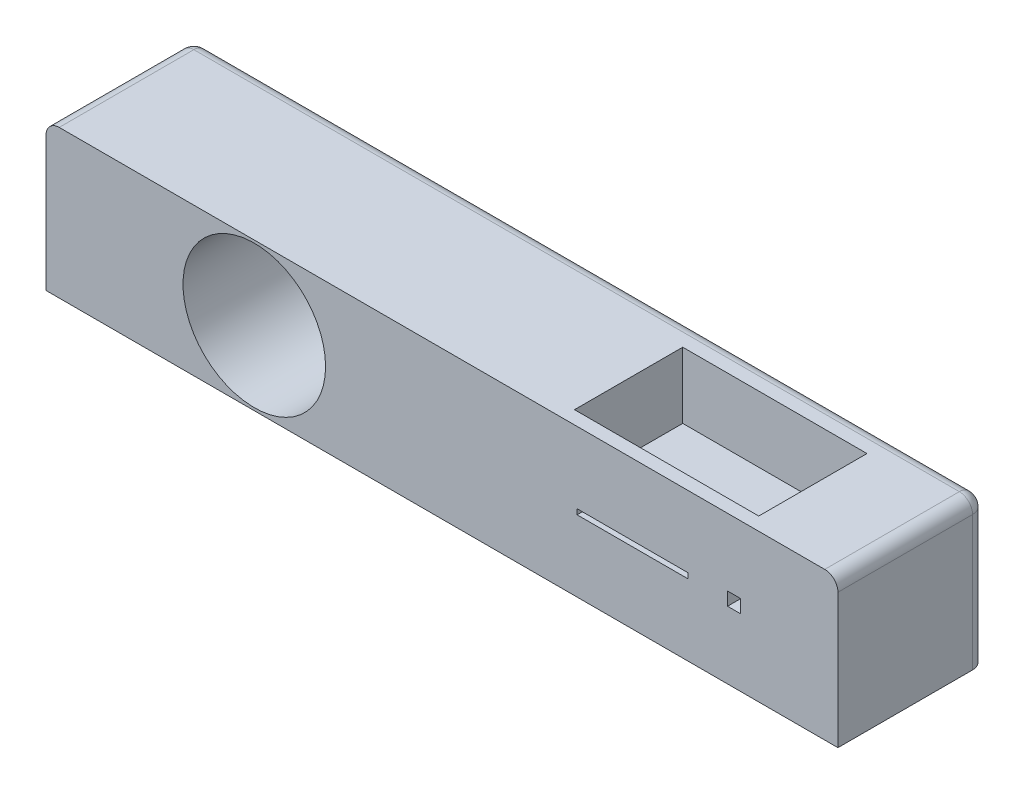
ISO-10303-21;
HEADER;
FILE_DESCRIPTION(('STEP AP214'),'2;1');
FILE_NAME('part.step','',(''),(''),'','','');
FILE_SCHEMA(('AUTOMOTIVE_DESIGN { 1 0 10303 214 1 1 1 1 }'));
ENDSEC;
DATA;
#1=APPLICATION_CONTEXT('core data for automotive mechanical design processes');
#2=APPLICATION_PROTOCOL_DEFINITION('international standard','automotive_design',2000,#1);
#3=PRODUCT_CONTEXT('',#1,'mechanical');
#4=PRODUCT('Part','Part','',(#3));
#5=PRODUCT_RELATED_PRODUCT_CATEGORY('part','',(#4));
#6=PRODUCT_DEFINITION_FORMATION('','',#4);
#7=PRODUCT_DEFINITION_CONTEXT('part definition',#1,'design');
#8=PRODUCT_DEFINITION('design','',#6,#7);
#9=PRODUCT_DEFINITION_SHAPE('','',#8);
#10=(LENGTH_UNIT() NAMED_UNIT(*) SI_UNIT(.MILLI.,.METRE.));
#11=(NAMED_UNIT(*) PLANE_ANGLE_UNIT() SI_UNIT($,.RADIAN.));
#12=(NAMED_UNIT(*) SI_UNIT($,.STERADIAN.) SOLID_ANGLE_UNIT());
#13=UNCERTAINTY_MEASURE_WITH_UNIT(LENGTH_MEASURE(1.E-05),#10,'distance_accuracy_value','');
#14=(GEOMETRIC_REPRESENTATION_CONTEXT(3) GLOBAL_UNCERTAINTY_ASSIGNED_CONTEXT((#13)) GLOBAL_UNIT_ASSIGNED_CONTEXT((#10,
#11,#12)) REPRESENTATION_CONTEXT('',''));
#15=CARTESIAN_POINT('',(0.,0.,0.));
#16=DIRECTION('',(0.,0.,1.));
#17=DIRECTION('',(1.,0.,0.));
#18=AXIS2_PLACEMENT_3D('',#15,#16,#17);
#19=CARTESIAN_POINT('',(150.,-28.,56.));
#20=DIRECTION('',(-1.,0.,0.));
#21=DIRECTION('',(0.,0.,1.));
#22=AXIS2_PLACEMENT_3D('',#19,#20,#21);
#23=PLANE('',#22);
#24=DIRECTION('',(0.,0.,-1.));
#25=VECTOR('',#24,1.);
#26=CARTESIAN_POINT('',(150.,-28.,56.));
#27=LINE('',#26,#25);
#28=CARTESIAN_POINT('',(150.,-28.,56.));
#29=VERTEX_POINT('',#28);
#30=CARTESIAN_POINT('',(150.,-28.,5.));
#31=VERTEX_POINT('',#30);
#32=EDGE_CURVE('E289',#29,#31,#27,.T.);
#33=ORIENTED_EDGE('',*,*,#32,.T.);
#34=DIRECTION('',(0.,1.,0.));
#35=VECTOR('',#34,1.);
#36=CARTESIAN_POINT('',(150.,28.,5.));
#37=LINE('',#36,#35);
#38=CARTESIAN_POINT('',(150.,23.,5.));
#39=VERTEX_POINT('',#38);
#40=EDGE_CURVE('E12',#31,#39,#37,.T.);
#41=ORIENTED_EDGE('',*,*,#40,.T.);
#42=DIRECTION('',(0.,0.,-1.));
#43=VECTOR('',#42,1.);
#44=CARTESIAN_POINT('',(150.,23.,56.));
#45=LINE('',#44,#43);
#46=CARTESIAN_POINT('',(150.,23.,56.));
#47=VERTEX_POINT('',#46);
#48=EDGE_CURVE('E44',#39,#47,#45,.F.);
#49=ORIENTED_EDGE('',*,*,#48,.T.);
#50=DIRECTION('',(0.,1.,0.));
#51=VECTOR('',#50,1.);
#52=CARTESIAN_POINT('',(150.,-28.,56.));
#53=LINE('',#52,#51);
#54=EDGE_CURVE('E278',#29,#47,#53,.T.);
#55=ORIENTED_EDGE('',*,*,#54,.F.);
#56=EDGE_LOOP('',(#33,#41,#49,#55));
#57=FACE_BOUND('',#56,.T.);
#58=ADVANCED_FACE('F35',(#57),#23,.F.);
#59=CARTESIAN_POINT('',(-150.,28.,56.));
#60=DIRECTION('',(0.,-1.,0.));
#61=DIRECTION('',(0.,0.,-1.));
#62=AXIS2_PLACEMENT_3D('',#59,#60,#61);
#63=PLANE('',#62);
#64=DIRECTION('',(-1.,0.,0.));
#65=VECTOR('',#64,1.);
#66=CARTESIAN_POINT('',(115.,28.,10.));
#67=LINE('',#66,#65);
#68=CARTESIAN_POINT('',(115.,28.,10.));
#69=VERTEX_POINT('',#68);
#70=CARTESIAN_POINT('',(45.2095928076517,28.,10.));
#71=VERTEX_POINT('',#70);
#72=EDGE_CURVE('E190',#69,#71,#67,.T.);
#73=ORIENTED_EDGE('',*,*,#72,.F.);
#74=DIRECTION('',(0.,0.,-1.));
#75=VECTOR('',#74,1.);
#76=CARTESIAN_POINT('',(115.,28.,51.));
#77=LINE('',#76,#75);
#78=CARTESIAN_POINT('',(115.,28.,51.));
#79=VERTEX_POINT('',#78);
#80=EDGE_CURVE('E52',#79,#69,#77,.T.);
#81=ORIENTED_EDGE('',*,*,#80,.F.);
#82=DIRECTION('',(1.,0.,0.));
#83=VECTOR('',#82,1.);
#84=CARTESIAN_POINT('',(115.,28.,51.));
#85=LINE('',#84,#83);
#86=CARTESIAN_POINT('',(45.2095928076517,28.,51.));
#87=VERTEX_POINT('',#86);
#88=EDGE_CURVE('E197',#87,#79,#85,.T.);
#89=ORIENTED_EDGE('',*,*,#88,.F.);
#90=DIRECTION('',(0.,0.,1.));
#91=VECTOR('',#90,1.);
#92=CARTESIAN_POINT('',(45.2095928076517,28.,51.));
#93=LINE('',#92,#91);
#94=EDGE_CURVE('E180',#71,#87,#93,.T.);
#95=ORIENTED_EDGE('',*,*,#94,.F.);
#96=EDGE_LOOP('',(#73,#81,#89,#95));
#97=FACE_BOUND('',#96,.T.);
#98=DIRECTION('',(-1.,0.,0.));
#99=VECTOR('',#98,1.);
#100=CARTESIAN_POINT('',(-150.,28.,5.));
#101=LINE('',#100,#99);
#102=CARTESIAN_POINT('',(145.,28.,5.));
#103=VERTEX_POINT('',#102);
#104=CARTESIAN_POINT('',(-145.,28.,5.));
#105=VERTEX_POINT('',#104);
#106=EDGE_CURVE('E312',#103,#105,#101,.T.);
#107=ORIENTED_EDGE('',*,*,#106,.T.);
#108=DIRECTION('',(0.,0.,-1.));
#109=VECTOR('',#108,1.);
#110=CARTESIAN_POINT('',(-145.,28.,56.));
#111=LINE('',#110,#109);
#112=CARTESIAN_POINT('',(-145.,28.,56.));
#113=VERTEX_POINT('',#112);
#114=EDGE_CURVE('E316',#105,#113,#111,.F.);
#115=ORIENTED_EDGE('',*,*,#114,.T.);
#116=DIRECTION('',(-1.,0.,0.));
#117=VECTOR('',#116,1.);
#118=CARTESIAN_POINT('',(-150.,28.,56.));
#119=LINE('',#118,#117);
#120=CARTESIAN_POINT('',(145.,28.,56.));
#121=VERTEX_POINT('',#120);
#122=EDGE_CURVE('E281',#121,#113,#119,.T.);
#123=ORIENTED_EDGE('',*,*,#122,.F.);
#124=DIRECTION('',(0.,0.,-1.));
#125=VECTOR('',#124,1.);
#126=CARTESIAN_POINT('',(145.,28.,56.));
#127=LINE('',#126,#125);
#128=EDGE_CURVE('E314',#121,#103,#127,.T.);
#129=ORIENTED_EDGE('',*,*,#128,.T.);
#130=EDGE_LOOP('',(#107,#115,#123,#129));
#131=FACE_BOUND('',#130,.T.);
#132=ADVANCED_FACE('F194',(#97,#131),#63,.F.);
#133=CARTESIAN_POINT('',(-150.,-28.,56.));
#134=DIRECTION('',(1.,0.,0.));
#135=DIRECTION('',(0.,0.,-1.));
#136=AXIS2_PLACEMENT_3D('',#133,#134,#135);
#137=PLANE('',#136);
#138=DIRECTION('',(0.,0.,-1.));
#139=VECTOR('',#138,1.);
#140=CARTESIAN_POINT('',(-150.,23.,56.));
#141=LINE('',#140,#139);
#142=CARTESIAN_POINT('',(-150.,23.,56.));
#143=VERTEX_POINT('',#142);
#144=CARTESIAN_POINT('',(-150.,23.,5.));
#145=VERTEX_POINT('',#144);
#146=EDGE_CURVE('E297',#143,#145,#141,.T.);
#147=ORIENTED_EDGE('',*,*,#146,.T.);
#148=DIRECTION('',(0.,-1.,0.));
#149=VECTOR('',#148,1.);
#150=CARTESIAN_POINT('',(-150.,-28.,5.));
#151=LINE('',#150,#149);
#152=CARTESIAN_POINT('',(-150.,-28.,5.));
#153=VERTEX_POINT('',#152);
#154=EDGE_CURVE('E299',#145,#153,#151,.T.);
#155=ORIENTED_EDGE('',*,*,#154,.T.);
#156=DIRECTION('',(0.,0.,-1.));
#157=VECTOR('',#156,1.);
#158=CARTESIAN_POINT('',(-150.,-28.,56.));
#159=LINE('',#158,#157);
#160=CARTESIAN_POINT('',(-150.,-28.,56.));
#161=VERTEX_POINT('',#160);
#162=EDGE_CURVE('E294',#161,#153,#159,.T.);
#163=ORIENTED_EDGE('',*,*,#162,.F.);
#164=DIRECTION('',(0.,-1.,0.));
#165=VECTOR('',#164,1.);
#166=CARTESIAN_POINT('',(-150.,-28.,56.));
#167=LINE('',#166,#165);
#168=EDGE_CURVE('E285',#143,#161,#167,.T.);
#169=ORIENTED_EDGE('',*,*,#168,.F.);
#170=EDGE_LOOP('',(#147,#155,#163,#169));
#171=FACE_BOUND('',#170,.T.);
#172=ADVANCED_FACE('F363',(#171),#137,.F.);
#173=CARTESIAN_POINT('',(-150.,-28.,56.));
#174=DIRECTION('',(0.,1.,0.));
#175=DIRECTION('',(0.,0.,1.));
#176=AXIS2_PLACEMENT_3D('',#173,#174,#175);
#177=PLANE('',#176);
#178=ORIENTED_EDGE('',*,*,#162,.T.);
#179=CARTESIAN_POINT('',(-145.,-28.,5.));
#180=DIRECTION('',(0.,1.,0.));
#181=DIRECTION('',(0.,0.,1.));
#182=AXIS2_PLACEMENT_3D('',#179,#180,#181);
#183=CIRCLE('',#182,5.);
#184=CARTESIAN_POINT('',(-145.,-28.,0.));
#185=VERTEX_POINT('',#184);
#186=EDGE_CURVE('E304',#153,#185,#183,.F.);
#187=ORIENTED_EDGE('',*,*,#186,.T.);
#188=DIRECTION('',(1.,0.,0.));
#189=VECTOR('',#188,1.);
#190=CARTESIAN_POINT('',(-150.,-28.,0.));
#191=LINE('',#190,#189);
#192=CARTESIAN_POINT('',(145.,-28.,0.));
#193=VERTEX_POINT('',#192);
#194=EDGE_CURVE('E282',#185,#193,#191,.T.);
#195=ORIENTED_EDGE('',*,*,#194,.T.);
#196=CARTESIAN_POINT('',(145.,-28.,5.));
#197=DIRECTION('',(0.,1.,0.));
#198=DIRECTION('',(0.,0.,1.));
#199=AXIS2_PLACEMENT_3D('',#196,#197,#198);
#200=CIRCLE('',#199,5.);
#201=EDGE_CURVE('E302',#193,#31,#200,.F.);
#202=ORIENTED_EDGE('',*,*,#201,.T.);
#203=ORIENTED_EDGE('',*,*,#32,.F.);
#204=DIRECTION('',(1.,0.,0.));
#205=VECTOR('',#204,1.);
#206=CARTESIAN_POINT('',(-150.,-28.,56.));
#207=LINE('',#206,#205);
#208=EDGE_CURVE('E287',#161,#29,#207,.T.);
#209=ORIENTED_EDGE('',*,*,#208,.F.);
#210=EDGE_LOOP('',(#178,#187,#195,#202,#203,#209));
#211=FACE_BOUND('',#210,.T.);
#212=ADVANCED_FACE('F368',(#211),#177,.F.);
#213=CARTESIAN_POINT('',(0.,0.,56.));
#214=DIRECTION('',(0.,0.,-1.));
#215=DIRECTION('',(-1.,0.,0.));
#216=AXIS2_PLACEMENT_3D('',#213,#214,#215);
#217=PLANE('',#216);
#218=CARTESIAN_POINT('',(-71.0953562443222,0.,56.));
#219=DIRECTION('',(0.,0.,1.));
#220=DIRECTION('',(1.,0.,0.));
#221=AXIS2_PLACEMENT_3D('',#218,#219,#220);
#222=CIRCLE('',#221,27.);
#223=CARTESIAN_POINT('',(-44.0953562443222,0.,56.));
#224=VERTEX_POINT('',#223);
#225=EDGE_CURVE('E210',#224,#224,#222,.T.);
#226=ORIENTED_EDGE('',*,*,#225,.F.);
#227=EDGE_LOOP('',(#226));
#228=FACE_BOUND('',#227,.T.);
#229=DIRECTION('',(0.,-1.,0.));
#230=VECTOR('',#229,1.);
#231=CARTESIAN_POINT('',(51.1822612430776,0.999999999999991,56.));
#232=LINE('',#231,#230);
#233=CARTESIAN_POINT('',(51.1822612430776,0.999999999999991,56.));
#234=VERTEX_POINT('',#233);
#235=CARTESIAN_POINT('',(51.1822612430776,-1.00000000000001,56.));
#236=VERTEX_POINT('',#235);
#237=EDGE_CURVE('E220',#234,#236,#232,.T.);
#238=ORIENTED_EDGE('',*,*,#237,.F.);
#239=DIRECTION('',(-1.,0.,0.));
#240=VECTOR('',#239,1.);
#241=CARTESIAN_POINT('',(51.1822612430776,0.999999999999991,56.));
#242=LINE('',#241,#240);
#243=CARTESIAN_POINT('',(93.1822612430776,0.999999999999991,56.));
#244=VERTEX_POINT('',#243);
#245=EDGE_CURVE('E223',#244,#234,#242,.T.);
#246=ORIENTED_EDGE('',*,*,#245,.F.);
#247=DIRECTION('',(0.,1.,0.));
#248=VECTOR('',#247,1.);
#249=CARTESIAN_POINT('',(93.1822612430776,0.999999999999991,56.));
#250=LINE('',#249,#248);
#251=CARTESIAN_POINT('',(93.1822612430776,-1.00000000000001,56.));
#252=VERTEX_POINT('',#251);
#253=EDGE_CURVE('E226',#252,#244,#250,.T.);
#254=ORIENTED_EDGE('',*,*,#253,.F.);
#255=DIRECTION('',(1.,0.,0.));
#256=VECTOR('',#255,1.);
#257=CARTESIAN_POINT('',(51.1822612430776,-1.00000000000001,56.));
#258=LINE('',#257,#256);
#259=EDGE_CURVE('E60',#236,#252,#258,.T.);
#260=ORIENTED_EDGE('',*,*,#259,.F.);
#261=EDGE_LOOP('',(#238,#246,#254,#260));
#262=FACE_BOUND('',#261,.T.);
#263=DIRECTION('',(0.,-1.,0.));
#264=VECTOR('',#263,1.);
#265=CARTESIAN_POINT('',(108.182261243078,2.5,56.));
#266=LINE('',#265,#264);
#267=CARTESIAN_POINT('',(108.182261243078,2.5,56.));
#268=VERTEX_POINT('',#267);
#269=CARTESIAN_POINT('',(108.182261243078,-2.5,56.));
#270=VERTEX_POINT('',#269);
#271=EDGE_CURVE('E251',#268,#270,#266,.T.);
#272=ORIENTED_EDGE('',*,*,#271,.F.);
#273=DIRECTION('',(-1.,0.,0.));
#274=VECTOR('',#273,1.);
#275=CARTESIAN_POINT('',(108.182261243078,2.5,56.));
#276=LINE('',#275,#274);
#277=CARTESIAN_POINT('',(113.182261243078,2.5,56.));
#278=VERTEX_POINT('',#277);
#279=EDGE_CURVE('E254',#278,#268,#276,.T.);
#280=ORIENTED_EDGE('',*,*,#279,.F.);
#281=DIRECTION('',(0.,1.,0.));
#282=VECTOR('',#281,1.);
#283=CARTESIAN_POINT('',(113.182261243078,2.5,56.));
#284=LINE('',#283,#282);
#285=CARTESIAN_POINT('',(113.182261243078,-2.5,56.));
#286=VERTEX_POINT('',#285);
#287=EDGE_CURVE('E208',#286,#278,#284,.T.);
#288=ORIENTED_EDGE('',*,*,#287,.F.);
#289=DIRECTION('',(1.,0.,0.));
#290=VECTOR('',#289,1.);
#291=CARTESIAN_POINT('',(108.182261243078,-2.5,56.));
#292=LINE('',#291,#290);
#293=EDGE_CURVE('E248',#270,#286,#292,.T.);
#294=ORIENTED_EDGE('',*,*,#293,.F.);
#295=EDGE_LOOP('',(#272,#280,#288,#294));
#296=FACE_BOUND('',#295,.T.);
#297=ORIENTED_EDGE('',*,*,#122,.T.);
#298=CARTESIAN_POINT('',(-145.,23.,56.));
#299=DIRECTION('',(0.,0.,-1.));
#300=DIRECTION('',(-1.,0.,0.));
#301=AXIS2_PLACEMENT_3D('',#298,#299,#300);
#302=CIRCLE('',#301,5.);
#303=EDGE_CURVE('E320',#113,#143,#302,.F.);
#304=ORIENTED_EDGE('',*,*,#303,.T.);
#305=ORIENTED_EDGE('',*,*,#168,.T.);
#306=ORIENTED_EDGE('',*,*,#208,.T.);
#307=ORIENTED_EDGE('',*,*,#54,.T.);
#308=CARTESIAN_POINT('',(145.,23.,56.));
#309=DIRECTION('',(0.,0.,-1.));
#310=DIRECTION('',(-1.,0.,0.));
#311=AXIS2_PLACEMENT_3D('',#308,#309,#310);
#312=CIRCLE('',#311,5.);
#313=EDGE_CURVE('E318',#47,#121,#312,.F.);
#314=ORIENTED_EDGE('',*,*,#313,.T.);
#315=EDGE_LOOP('',(#297,#304,#305,#306,#307,#314));
#316=FACE_BOUND('',#315,.T.);
#317=ADVANCED_FACE('F360',(#228,#262,#296,#316),#217,.F.);
#318=CARTESIAN_POINT('',(0.,0.,0.));
#319=DIRECTION('',(0.,0.,-1.));
#320=DIRECTION('',(-1.,0.,0.));
#321=AXIS2_PLACEMENT_3D('',#318,#319,#320);
#322=PLANE('',#321);
#323=ORIENTED_EDGE('',*,*,#194,.F.);
#324=DIRECTION('',(0.,-1.,0.));
#325=VECTOR('',#324,1.);
#326=CARTESIAN_POINT('',(-145.,28.,0.));
#327=LINE('',#326,#325);
#328=CARTESIAN_POINT('',(-145.,23.,0.));
#329=VERTEX_POINT('',#328);
#330=EDGE_CURVE('E310',#185,#329,#327,.F.);
#331=ORIENTED_EDGE('',*,*,#330,.T.);
#332=DIRECTION('',(-1.,0.,0.));
#333=VECTOR('',#332,1.);
#334=CARTESIAN_POINT('',(150.,23.,0.));
#335=LINE('',#334,#333);
#336=CARTESIAN_POINT('',(145.,23.,0.));
#337=VERTEX_POINT('',#336);
#338=EDGE_CURVE('E306',#329,#337,#335,.F.);
#339=ORIENTED_EDGE('',*,*,#338,.T.);
#340=DIRECTION('',(0.,1.,0.));
#341=VECTOR('',#340,1.);
#342=CARTESIAN_POINT('',(145.,-28.,0.));
#343=LINE('',#342,#341);
#344=EDGE_CURVE('E308',#337,#193,#343,.F.);
#345=ORIENTED_EDGE('',*,*,#344,.T.);
#346=EDGE_LOOP('',(#323,#331,#339,#345));
#347=FACE_BOUND('',#346,.T.);
#348=ADVANCED_FACE('F379',(#347),#322,.T.);
#349=CARTESIAN_POINT('',(145.,-28.,5.));
#350=DIRECTION('',(0.,-1.,0.));
#351=DIRECTION('',(0.,0.,-1.));
#352=AXIS2_PLACEMENT_3D('',#349,#350,#351);
#353=CYLINDRICAL_SURFACE('',#352,5.);
#354=ORIENTED_EDGE('',*,*,#201,.F.);
#355=ORIENTED_EDGE('',*,*,#344,.F.);
#356=CARTESIAN_POINT('',(145.,23.,5.));
#357=DIRECTION('',(0.,1.,0.));
#358=DIRECTION('',(0.,0.,1.));
#359=AXIS2_PLACEMENT_3D('',#356,#357,#358);
#360=CIRCLE('',#359,5.);
#361=EDGE_CURVE('E39',#39,#337,#360,.T.);
#362=ORIENTED_EDGE('',*,*,#361,.F.);
#363=ORIENTED_EDGE('',*,*,#40,.F.);
#364=EDGE_LOOP('',(#354,#355,#362,#363));
#365=FACE_BOUND('',#364,.T.);
#366=ADVANCED_FACE('F37',(#365),#353,.T.);
#367=CARTESIAN_POINT('',(145.,23.,56.));
#368=DIRECTION('',(0.,0.,-1.));
#369=DIRECTION('',(-1.,0.,0.));
#370=AXIS2_PLACEMENT_3D('',#367,#368,#369);
#371=CYLINDRICAL_SURFACE('',#370,5.);
#372=ORIENTED_EDGE('',*,*,#313,.F.);
#373=ORIENTED_EDGE('',*,*,#48,.F.);
#374=CARTESIAN_POINT('',(145.,23.,5.));
#375=DIRECTION('',(0.,0.,-1.));
#376=DIRECTION('',(-1.,0.,0.));
#377=AXIS2_PLACEMENT_3D('',#374,#375,#376);
#378=CIRCLE('',#377,5.);
#379=EDGE_CURVE('E333',#103,#39,#378,.T.);
#380=ORIENTED_EDGE('',*,*,#379,.F.);
#381=ORIENTED_EDGE('',*,*,#128,.F.);
#382=EDGE_LOOP('',(#372,#373,#380,#381));
#383=FACE_BOUND('',#382,.T.);
#384=ADVANCED_FACE('F374',(#383),#371,.T.);
#385=CARTESIAN_POINT('',(145.,23.,5.));
#386=DIRECTION('',(0.,0.,1.));
#387=DIRECTION('',(1.,0.,0.));
#388=AXIS2_PLACEMENT_3D('',#385,#386,#387);
#389=SPHERICAL_SURFACE('',#388,5.);
#390=ORIENTED_EDGE('',*,*,#379,.T.);
#391=ORIENTED_EDGE('',*,*,#361,.T.);
#392=CARTESIAN_POINT('',(145.,23.,5.));
#393=DIRECTION('',(1.,0.,0.));
#394=DIRECTION('',(0.,0.,-1.));
#395=AXIS2_PLACEMENT_3D('',#392,#393,#394);
#396=CIRCLE('',#395,5.);
#397=EDGE_CURVE('E331',#103,#337,#396,.F.);
#398=ORIENTED_EDGE('',*,*,#397,.F.);
#399=EDGE_LOOP('',(#390,#391,#398));
#400=FACE_BOUND('',#399,.T.);
#401=ADVANCED_FACE('F340',(#400),#389,.T.);
#402=CARTESIAN_POINT('',(-150.,23.,5.));
#403=DIRECTION('',(1.,0.,0.));
#404=DIRECTION('',(0.,0.,-1.));
#405=AXIS2_PLACEMENT_3D('',#402,#403,#404);
#406=CYLINDRICAL_SURFACE('',#405,5.);
#407=ORIENTED_EDGE('',*,*,#397,.T.);
#408=ORIENTED_EDGE('',*,*,#338,.F.);
#409=CARTESIAN_POINT('',(-145.,23.,5.));
#410=DIRECTION('',(-1.,0.,0.));
#411=DIRECTION('',(0.,0.,1.));
#412=AXIS2_PLACEMENT_3D('',#409,#410,#411);
#413=CIRCLE('',#412,5.);
#414=EDGE_CURVE('E328',#105,#329,#413,.T.);
#415=ORIENTED_EDGE('',*,*,#414,.F.);
#416=ORIENTED_EDGE('',*,*,#106,.F.);
#417=EDGE_LOOP('',(#407,#408,#415,#416));
#418=FACE_BOUND('',#417,.T.);
#419=ADVANCED_FACE('F347',(#418),#406,.T.);
#420=CARTESIAN_POINT('',(-145.,23.,56.));
#421=DIRECTION('',(0.,0.,-1.));
#422=DIRECTION('',(-1.,0.,0.));
#423=AXIS2_PLACEMENT_3D('',#420,#421,#422);
#424=CYLINDRICAL_SURFACE('',#423,5.);
#425=ORIENTED_EDGE('',*,*,#303,.F.);
#426=ORIENTED_EDGE('',*,*,#114,.F.);
#427=CARTESIAN_POINT('',(-145.,23.,5.));
#428=DIRECTION('',(0.,0.,-1.));
#429=DIRECTION('',(-1.,0.,0.));
#430=AXIS2_PLACEMENT_3D('',#427,#428,#429);
#431=CIRCLE('',#430,5.);
#432=EDGE_CURVE('E325',#145,#105,#431,.T.);
#433=ORIENTED_EDGE('',*,*,#432,.F.);
#434=ORIENTED_EDGE('',*,*,#146,.F.);
#435=EDGE_LOOP('',(#425,#426,#433,#434));
#436=FACE_BOUND('',#435,.T.);
#437=ADVANCED_FACE('F355',(#436),#424,.T.);
#438=CARTESIAN_POINT('',(-145.,23.,5.));
#439=DIRECTION('',(0.,0.,1.));
#440=DIRECTION('',(1.,0.,0.));
#441=AXIS2_PLACEMENT_3D('',#438,#439,#440);
#442=SPHERICAL_SURFACE('',#441,5.);
#443=ORIENTED_EDGE('',*,*,#432,.T.);
#444=ORIENTED_EDGE('',*,*,#414,.T.);
#445=CARTESIAN_POINT('',(-145.,23.,5.));
#446=DIRECTION('',(0.,1.,0.));
#447=DIRECTION('',(-1.,0.,0.));
#448=AXIS2_PLACEMENT_3D('',#445,#446,#447);
#449=CIRCLE('',#448,5.);
#450=EDGE_CURVE('E217',#145,#329,#449,.F.);
#451=ORIENTED_EDGE('',*,*,#450,.F.);
#452=EDGE_LOOP('',(#443,#444,#451));
#453=FACE_BOUND('',#452,.T.);
#454=ADVANCED_FACE('F383',(#453),#442,.T.);
#455=CARTESIAN_POINT('',(-145.,-28.,5.));
#456=DIRECTION('',(0.,1.,0.));
#457=DIRECTION('',(0.,0.,1.));
#458=AXIS2_PLACEMENT_3D('',#455,#456,#457);
#459=CYLINDRICAL_SURFACE('',#458,5.);
#460=ORIENTED_EDGE('',*,*,#450,.T.);
#461=ORIENTED_EDGE('',*,*,#330,.F.);
#462=ORIENTED_EDGE('',*,*,#186,.F.);
#463=ORIENTED_EDGE('',*,*,#154,.F.);
#464=EDGE_LOOP('',(#460,#461,#462,#463));
#465=FACE_BOUND('',#464,.T.);
#466=ADVANCED_FACE('F381',(#465),#459,.T.);
#467=CARTESIAN_POINT('',(0.,0.,5.99999999999999));
#468=DIRECTION('',(0.,0.,-1.));
#469=DIRECTION('',(-1.,0.,0.));
#470=AXIS2_PLACEMENT_3D('',#467,#468,#469);
#471=PLANE('',#470);
#472=DIRECTION('',(0.,1.,0.));
#473=VECTOR('',#472,1.);
#474=CARTESIAN_POINT('',(113.182261243078,2.5,5.99999999999999));
#475=LINE('',#474,#473);
#476=CARTESIAN_POINT('',(113.182261243078,-2.5,5.99999999999999));
#477=VERTEX_POINT('',#476);
#478=CARTESIAN_POINT('',(113.182261243078,2.5,5.99999999999999));
#479=VERTEX_POINT('',#478);
#480=EDGE_CURVE('E262',#477,#479,#475,.T.);
#481=ORIENTED_EDGE('',*,*,#480,.T.);
#482=DIRECTION('',(-1.,0.,0.));
#483=VECTOR('',#482,1.);
#484=CARTESIAN_POINT('',(108.182261243078,2.5,5.99999999999999));
#485=LINE('',#484,#483);
#486=CARTESIAN_POINT('',(108.182261243078,2.5,5.99999999999999));
#487=VERTEX_POINT('',#486);
#488=EDGE_CURVE('E250',#479,#487,#485,.T.);
#489=ORIENTED_EDGE('',*,*,#488,.T.);
#490=DIRECTION('',(0.,-1.,0.));
#491=VECTOR('',#490,1.);
#492=CARTESIAN_POINT('',(108.182261243078,2.5,5.99999999999999));
#493=LINE('',#492,#491);
#494=CARTESIAN_POINT('',(108.182261243078,-2.5,5.99999999999999));
#495=VERTEX_POINT('',#494);
#496=EDGE_CURVE('E270',#487,#495,#493,.T.);
#497=ORIENTED_EDGE('',*,*,#496,.T.);
#498=DIRECTION('',(1.,0.,0.));
#499=VECTOR('',#498,1.);
#500=CARTESIAN_POINT('',(108.182261243078,-2.5,5.99999999999999));
#501=LINE('',#500,#499);
#502=EDGE_CURVE('E266',#495,#477,#501,.T.);
#503=ORIENTED_EDGE('',*,*,#502,.T.);
#504=EDGE_LOOP('',(#481,#489,#497,#503));
#505=FACE_BOUND('',#504,.T.);
#506=ADVANCED_FACE('F390',(#505),#471,.F.);
#507=CARTESIAN_POINT('',(108.182261243078,2.5,-76.3675323681471));
#508=DIRECTION('',(0.,1.,0.));
#509=DIRECTION('',(0.,0.,1.));
#510=AXIS2_PLACEMENT_3D('',#507,#508,#509);
#511=PLANE('',#510);
#512=DIRECTION('',(0.,0.,1.));
#513=VECTOR('',#512,1.);
#514=CARTESIAN_POINT('',(113.182261243078,2.5,-76.3675323681471));
#515=LINE('',#514,#513);
#516=EDGE_CURVE('E229',#479,#278,#515,.T.);
#517=ORIENTED_EDGE('',*,*,#516,.T.);
#518=ORIENTED_EDGE('',*,*,#279,.T.);
#519=DIRECTION('',(0.,0.,1.));
#520=VECTOR('',#519,1.);
#521=CARTESIAN_POINT('',(108.182261243078,2.5,-76.3675323681471));
#522=LINE('',#521,#520);
#523=EDGE_CURVE('E261',#487,#268,#522,.T.);
#524=ORIENTED_EDGE('',*,*,#523,.F.);
#525=ORIENTED_EDGE('',*,*,#488,.F.);
#526=EDGE_LOOP('',(#517,#518,#524,#525));
#527=FACE_BOUND('',#526,.T.);
#528=ADVANCED_FACE('F411',(#527),#511,.F.);
#529=CARTESIAN_POINT('',(108.182261243078,2.5,-76.3675323681471));
#530=DIRECTION('',(-1.,0.,0.));
#531=DIRECTION('',(0.,0.,1.));
#532=AXIS2_PLACEMENT_3D('',#529,#530,#531);
#533=PLANE('',#532);
#534=ORIENTED_EDGE('',*,*,#523,.T.);
#535=ORIENTED_EDGE('',*,*,#271,.T.);
#536=DIRECTION('',(0.,0.,1.));
#537=VECTOR('',#536,1.);
#538=CARTESIAN_POINT('',(108.182261243078,-2.5,-76.3675323681471));
#539=LINE('',#538,#537);
#540=EDGE_CURVE('E269',#495,#270,#539,.T.);
#541=ORIENTED_EDGE('',*,*,#540,.F.);
#542=ORIENTED_EDGE('',*,*,#496,.F.);
#543=EDGE_LOOP('',(#534,#535,#541,#542));
#544=FACE_BOUND('',#543,.T.);
#545=ADVANCED_FACE('F415',(#544),#533,.F.);
#546=CARTESIAN_POINT('',(108.182261243078,-2.5,-76.3675323681471));
#547=DIRECTION('',(0.,-1.,0.));
#548=DIRECTION('',(0.,0.,-1.));
#549=AXIS2_PLACEMENT_3D('',#546,#547,#548);
#550=PLANE('',#549);
#551=ORIENTED_EDGE('',*,*,#540,.T.);
#552=ORIENTED_EDGE('',*,*,#293,.T.);
#553=DIRECTION('',(0.,0.,1.));
#554=VECTOR('',#553,1.);
#555=CARTESIAN_POINT('',(113.182261243078,-2.5,-76.3675323681471));
#556=LINE('',#555,#554);
#557=EDGE_CURVE('E265',#477,#286,#556,.T.);
#558=ORIENTED_EDGE('',*,*,#557,.F.);
#559=ORIENTED_EDGE('',*,*,#502,.F.);
#560=EDGE_LOOP('',(#551,#552,#558,#559));
#561=FACE_BOUND('',#560,.T.);
#562=ADVANCED_FACE('F419',(#561),#550,.F.);
#563=CARTESIAN_POINT('',(113.182261243078,2.5,-76.3675323681471));
#564=DIRECTION('',(1.,0.,0.));
#565=DIRECTION('',(0.,0.,-1.));
#566=AXIS2_PLACEMENT_3D('',#563,#564,#565);
#567=PLANE('',#566);
#568=ORIENTED_EDGE('',*,*,#557,.T.);
#569=ORIENTED_EDGE('',*,*,#287,.T.);
#570=ORIENTED_EDGE('',*,*,#516,.F.);
#571=ORIENTED_EDGE('',*,*,#480,.F.);
#572=EDGE_LOOP('',(#568,#569,#570,#571));
#573=FACE_BOUND('',#572,.T.);
#574=ADVANCED_FACE('F423',(#573),#567,.F.);
#575=CARTESIAN_POINT('',(0.,0.,5.99999999999999));
#576=DIRECTION('',(0.,0.,-1.));
#577=DIRECTION('',(-1.,0.,0.));
#578=AXIS2_PLACEMENT_3D('',#575,#576,#577);
#579=PLANE('',#578);
#580=DIRECTION('',(0.,1.,0.));
#581=VECTOR('',#580,1.);
#582=CARTESIAN_POINT('',(93.1822612430776,0.999999999999991,5.99999999999999));
#583=LINE('',#582,#581);
#584=CARTESIAN_POINT('',(93.1822612430776,-1.00000000000001,5.99999999999999));
#585=VERTEX_POINT('',#584);
#586=CARTESIAN_POINT('',(93.1822612430776,0.999999999999991,5.99999999999999));
#587=VERTEX_POINT('',#586);
#588=EDGE_CURVE('E233',#585,#587,#583,.T.);
#589=ORIENTED_EDGE('',*,*,#588,.T.);
#590=DIRECTION('',(-1.,0.,0.));
#591=VECTOR('',#590,1.);
#592=CARTESIAN_POINT('',(51.1822612430776,0.999999999999991,5.99999999999999));
#593=LINE('',#592,#591);
#594=CARTESIAN_POINT('',(51.1822612430776,0.999999999999991,5.99999999999999));
#595=VERTEX_POINT('',#594);
#596=EDGE_CURVE('E219',#587,#595,#593,.T.);
#597=ORIENTED_EDGE('',*,*,#596,.T.);
#598=DIRECTION('',(0.,-1.,0.));
#599=VECTOR('',#598,1.);
#600=CARTESIAN_POINT('',(51.1822612430776,0.999999999999991,5.99999999999999));
#601=LINE('',#600,#599);
#602=CARTESIAN_POINT('',(51.1822612430776,-1.00000000000001,5.99999999999999));
#603=VERTEX_POINT('',#602);
#604=EDGE_CURVE('E241',#595,#603,#601,.T.);
#605=ORIENTED_EDGE('',*,*,#604,.T.);
#606=DIRECTION('',(1.,0.,0.));
#607=VECTOR('',#606,1.);
#608=CARTESIAN_POINT('',(51.1822612430776,-1.00000000000001,5.99999999999999));
#609=LINE('',#608,#607);
#610=EDGE_CURVE('E237',#603,#585,#609,.T.);
#611=ORIENTED_EDGE('',*,*,#610,.T.);
#612=EDGE_LOOP('',(#589,#597,#605,#611));
#613=FACE_BOUND('',#612,.T.);
#614=ADVANCED_FACE('F427',(#613),#579,.F.);
#615=CARTESIAN_POINT('',(51.1822612430776,0.999999999999991,-76.3675323681471));
#616=DIRECTION('',(0.,1.,0.));
#617=DIRECTION('',(0.,0.,1.));
#618=AXIS2_PLACEMENT_3D('',#615,#616,#617);
#619=PLANE('',#618);
#620=DIRECTION('',(0.,0.,1.));
#621=VECTOR('',#620,1.);
#622=CARTESIAN_POINT('',(93.1822612430776,0.999999999999991,-76.3675323681471));
#623=LINE('',#622,#621);
#624=EDGE_CURVE('E214',#587,#244,#623,.T.);
#625=ORIENTED_EDGE('',*,*,#624,.T.);
#626=ORIENTED_EDGE('',*,*,#245,.T.);
#627=DIRECTION('',(0.,0.,1.));
#628=VECTOR('',#627,1.);
#629=CARTESIAN_POINT('',(51.1822612430776,0.999999999999991,-76.3675323681471));
#630=LINE('',#629,#628);
#631=EDGE_CURVE('E232',#595,#234,#630,.T.);
#632=ORIENTED_EDGE('',*,*,#631,.F.);
#633=ORIENTED_EDGE('',*,*,#596,.F.);
#634=EDGE_LOOP('',(#625,#626,#632,#633));
#635=FACE_BOUND('',#634,.T.);
#636=ADVANCED_FACE('F431',(#635),#619,.F.);
#637=CARTESIAN_POINT('',(51.1822612430776,0.999999999999991,-76.3675323681471));
#638=DIRECTION('',(-1.,0.,0.));
#639=DIRECTION('',(0.,0.,1.));
#640=AXIS2_PLACEMENT_3D('',#637,#638,#639);
#641=PLANE('',#640);
#642=ORIENTED_EDGE('',*,*,#631,.T.);
#643=ORIENTED_EDGE('',*,*,#237,.T.);
#644=DIRECTION('',(0.,0.,1.));
#645=VECTOR('',#644,1.);
#646=CARTESIAN_POINT('',(51.1822612430776,-1.00000000000001,-76.3675323681471));
#647=LINE('',#646,#645);
#648=EDGE_CURVE('E240',#603,#236,#647,.T.);
#649=ORIENTED_EDGE('',*,*,#648,.F.);
#650=ORIENTED_EDGE('',*,*,#604,.F.);
#651=EDGE_LOOP('',(#642,#643,#649,#650));
#652=FACE_BOUND('',#651,.T.);
#653=ADVANCED_FACE('F435',(#652),#641,.F.);
#654=CARTESIAN_POINT('',(51.1822612430776,-1.00000000000001,-76.3675323681471));
#655=DIRECTION('',(0.,-1.,0.));
#656=DIRECTION('',(0.,0.,-1.));
#657=AXIS2_PLACEMENT_3D('',#654,#655,#656);
#658=PLANE('',#657);
#659=ORIENTED_EDGE('',*,*,#648,.T.);
#660=ORIENTED_EDGE('',*,*,#259,.T.);
#661=DIRECTION('',(0.,0.,1.));
#662=VECTOR('',#661,1.);
#663=CARTESIAN_POINT('',(93.1822612430776,-1.00000000000001,-76.3675323681471));
#664=LINE('',#663,#662);
#665=EDGE_CURVE('E236',#585,#252,#664,.T.);
#666=ORIENTED_EDGE('',*,*,#665,.F.);
#667=ORIENTED_EDGE('',*,*,#610,.F.);
#668=EDGE_LOOP('',(#659,#660,#666,#667));
#669=FACE_BOUND('',#668,.T.);
#670=ADVANCED_FACE('F439',(#669),#658,.F.);
#671=CARTESIAN_POINT('',(93.1822612430776,0.999999999999991,-76.3675323681471));
#672=DIRECTION('',(1.,0.,0.));
#673=DIRECTION('',(0.,0.,-1.));
#674=AXIS2_PLACEMENT_3D('',#671,#672,#673);
#675=PLANE('',#674);
#676=ORIENTED_EDGE('',*,*,#665,.T.);
#677=ORIENTED_EDGE('',*,*,#253,.T.);
#678=ORIENTED_EDGE('',*,*,#624,.F.);
#679=ORIENTED_EDGE('',*,*,#588,.F.);
#680=EDGE_LOOP('',(#676,#677,#678,#679));
#681=FACE_BOUND('',#680,.T.);
#682=ADVANCED_FACE('F443',(#681),#675,.F.);
#683=CARTESIAN_POINT('',(0.,0.,5.99999999999999));
#684=DIRECTION('',(0.,0.,-1.));
#685=DIRECTION('',(-1.,0.,0.));
#686=AXIS2_PLACEMENT_3D('',#683,#684,#685);
#687=PLANE('',#686);
#688=CARTESIAN_POINT('',(-71.0953562443222,0.,5.99999999999999));
#689=DIRECTION('',(0.,0.,-1.));
#690=DIRECTION('',(-1.,0.,0.));
#691=AXIS2_PLACEMENT_3D('',#688,#689,#690);
#692=CIRCLE('',#691,27.);
#693=CARTESIAN_POINT('',(-98.0953562443222,0.,5.99999999999999));
#694=VERTEX_POINT('',#693);
#695=EDGE_CURVE('E213',#694,#694,#692,.F.);
#696=ORIENTED_EDGE('',*,*,#695,.T.);
#697=EDGE_LOOP('',(#696));
#698=FACE_BOUND('',#697,.T.);
#699=ADVANCED_FACE('F446',(#698),#687,.F.);
#700=CARTESIAN_POINT('',(-71.0953562443222,0.,-76.3675323681471));
#701=DIRECTION('',(0.,0.,1.));
#702=DIRECTION('',(1.,0.,0.));
#703=AXIS2_PLACEMENT_3D('',#700,#701,#702);
#704=CYLINDRICAL_SURFACE('',#703,27.);
#705=ORIENTED_EDGE('',*,*,#225,.T.);
#706=EDGE_LOOP('',(#705));
#707=FACE_BOUND('',#706,.T.);
#708=ORIENTED_EDGE('',*,*,#695,.F.);
#709=EDGE_LOOP('',(#708));
#710=FACE_BOUND('',#709,.T.);
#711=ADVANCED_FACE('F450',(#707,#710),#704,.F.);
#712=CARTESIAN_POINT('',(115.,-79.9425780172202,51.));
#713=DIRECTION('',(1.,0.,0.));
#714=DIRECTION('',(0.,0.,-1.));
#715=AXIS2_PLACEMENT_3D('',#712,#713,#714);
#716=PLANE('',#715);
#717=DIRECTION('',(0.,0.,1.));
#718=VECTOR('',#717,1.);
#719=CARTESIAN_POINT('',(115.,2.99999999999999,51.));
#720=LINE('',#719,#718);
#721=CARTESIAN_POINT('',(115.,2.99999999999999,10.));
#722=VERTEX_POINT('',#721);
#723=CARTESIAN_POINT('',(115.,2.99999999999999,51.));
#724=VERTEX_POINT('',#723);
#725=EDGE_CURVE('E209',#722,#724,#720,.T.);
#726=ORIENTED_EDGE('',*,*,#725,.T.);
#727=DIRECTION('',(0.,1.,0.));
#728=VECTOR('',#727,1.);
#729=CARTESIAN_POINT('',(115.,-79.9425780172202,51.));
#730=LINE('',#729,#728);
#731=EDGE_CURVE('E202',#724,#79,#730,.T.);
#732=ORIENTED_EDGE('',*,*,#731,.T.);
#733=ORIENTED_EDGE('',*,*,#80,.T.);
#734=DIRECTION('',(0.,1.,0.));
#735=VECTOR('',#734,1.);
#736=CARTESIAN_POINT('',(115.,-79.9425780172202,10.));
#737=LINE('',#736,#735);
#738=EDGE_CURVE('E187',#722,#69,#737,.T.);
#739=ORIENTED_EDGE('',*,*,#738,.F.);
#740=EDGE_LOOP('',(#726,#732,#733,#739));
#741=FACE_BOUND('',#740,.T.);
#742=ADVANCED_FACE('F454',(#741),#716,.F.);
#743=CARTESIAN_POINT('',(115.,-79.9425780172202,51.));
#744=DIRECTION('',(0.,0.,1.));
#745=DIRECTION('',(1.,0.,0.));
#746=AXIS2_PLACEMENT_3D('',#743,#744,#745);
#747=PLANE('',#746);
#748=DIRECTION('',(-1.,0.,0.));
#749=VECTOR('',#748,1.);
#750=CARTESIAN_POINT('',(115.,2.99999999999999,51.));
#751=LINE('',#750,#749);
#752=CARTESIAN_POINT('',(45.2095928076517,2.99999999999999,51.));
#753=VERTEX_POINT('',#752);
#754=EDGE_CURVE('E473',#724,#753,#751,.T.);
#755=ORIENTED_EDGE('',*,*,#754,.T.);
#756=DIRECTION('',(0.,1.,0.));
#757=VECTOR('',#756,1.);
#758=CARTESIAN_POINT('',(45.2095928076517,-79.9425780172202,51.));
#759=LINE('',#758,#757);
#760=EDGE_CURVE('E186',#753,#87,#759,.T.);
#761=ORIENTED_EDGE('',*,*,#760,.T.);
#762=ORIENTED_EDGE('',*,*,#88,.T.);
#763=ORIENTED_EDGE('',*,*,#731,.F.);
#764=EDGE_LOOP('',(#755,#761,#762,#763));
#765=FACE_BOUND('',#764,.T.);
#766=ADVANCED_FACE('F458',(#765),#747,.F.);
#767=CARTESIAN_POINT('',(45.2095928076517,-79.9425780172202,51.));
#768=DIRECTION('',(-1.,0.,0.));
#769=DIRECTION('',(0.,0.,1.));
#770=AXIS2_PLACEMENT_3D('',#767,#768,#769);
#771=PLANE('',#770);
#772=DIRECTION('',(0.,0.,-1.));
#773=VECTOR('',#772,1.);
#774=CARTESIAN_POINT('',(45.2095928076517,2.99999999999999,51.));
#775=LINE('',#774,#773);
#776=CARTESIAN_POINT('',(45.2095928076517,2.99999999999999,10.));
#777=VERTEX_POINT('',#776);
#778=EDGE_CURVE('E183',#753,#777,#775,.T.);
#779=ORIENTED_EDGE('',*,*,#778,.T.);
#780=DIRECTION('',(0.,1.,0.));
#781=VECTOR('',#780,1.);
#782=CARTESIAN_POINT('',(45.2095928076517,-79.9425780172202,10.));
#783=LINE('',#782,#781);
#784=EDGE_CURVE('E175',#777,#71,#783,.T.);
#785=ORIENTED_EDGE('',*,*,#784,.T.);
#786=ORIENTED_EDGE('',*,*,#94,.T.);
#787=ORIENTED_EDGE('',*,*,#760,.F.);
#788=EDGE_LOOP('',(#779,#785,#786,#787));
#789=FACE_BOUND('',#788,.T.);
#790=ADVANCED_FACE('F177',(#789),#771,.F.);
#791=CARTESIAN_POINT('',(115.,-79.9425780172202,10.));
#792=DIRECTION('',(0.,0.,-1.));
#793=DIRECTION('',(-1.,0.,0.));
#794=AXIS2_PLACEMENT_3D('',#791,#792,#793);
#795=PLANE('',#794);
#796=DIRECTION('',(1.,0.,0.));
#797=VECTOR('',#796,1.);
#798=CARTESIAN_POINT('',(115.,2.99999999999999,10.));
#799=LINE('',#798,#797);
#800=EDGE_CURVE('E206',#777,#722,#799,.T.);
#801=ORIENTED_EDGE('',*,*,#800,.T.);
#802=ORIENTED_EDGE('',*,*,#738,.T.);
#803=ORIENTED_EDGE('',*,*,#72,.T.);
#804=ORIENTED_EDGE('',*,*,#784,.F.);
#805=EDGE_LOOP('',(#801,#802,#803,#804));
#806=FACE_BOUND('',#805,.T.);
#807=ADVANCED_FACE('F191',(#806),#795,.F.);
#808=CARTESIAN_POINT('',(51.1822612430776,2.99999999999999,-76.3675323681471));
#809=DIRECTION('',(0.,1.,0.));
#810=DIRECTION('',(0.,0.,1.));
#811=AXIS2_PLACEMENT_3D('',#808,#809,#810);
#812=PLANE('',#811);
#813=ORIENTED_EDGE('',*,*,#725,.F.);
#814=ORIENTED_EDGE('',*,*,#800,.F.);
#815=ORIENTED_EDGE('',*,*,#778,.F.);
#816=ORIENTED_EDGE('',*,*,#754,.F.);
#817=EDGE_LOOP('',(#813,#814,#815,#816));
#818=FACE_BOUND('',#817,.T.);
#819=ADVANCED_FACE('F461',(#818),#812,.T.);
#820=CLOSED_SHELL('',(#58,#132,#172,#212,#317,#348,#366,#384,#401,#419,#437,#454,#466,#506,#528,
#545,#562,#574,#614,#636,#653,#670,#682,#699,#711,#742,#766,#790,#807,#819));
#821=MANIFOLD_SOLID_BREP('B2',#820);
#822=ADVANCED_BREP_SHAPE_REPRESENTATION('',(#18,#821),#14);
#823=SHAPE_DEFINITION_REPRESENTATION(#9,#822);
ENDSEC;
END-ISO-10303-21;
